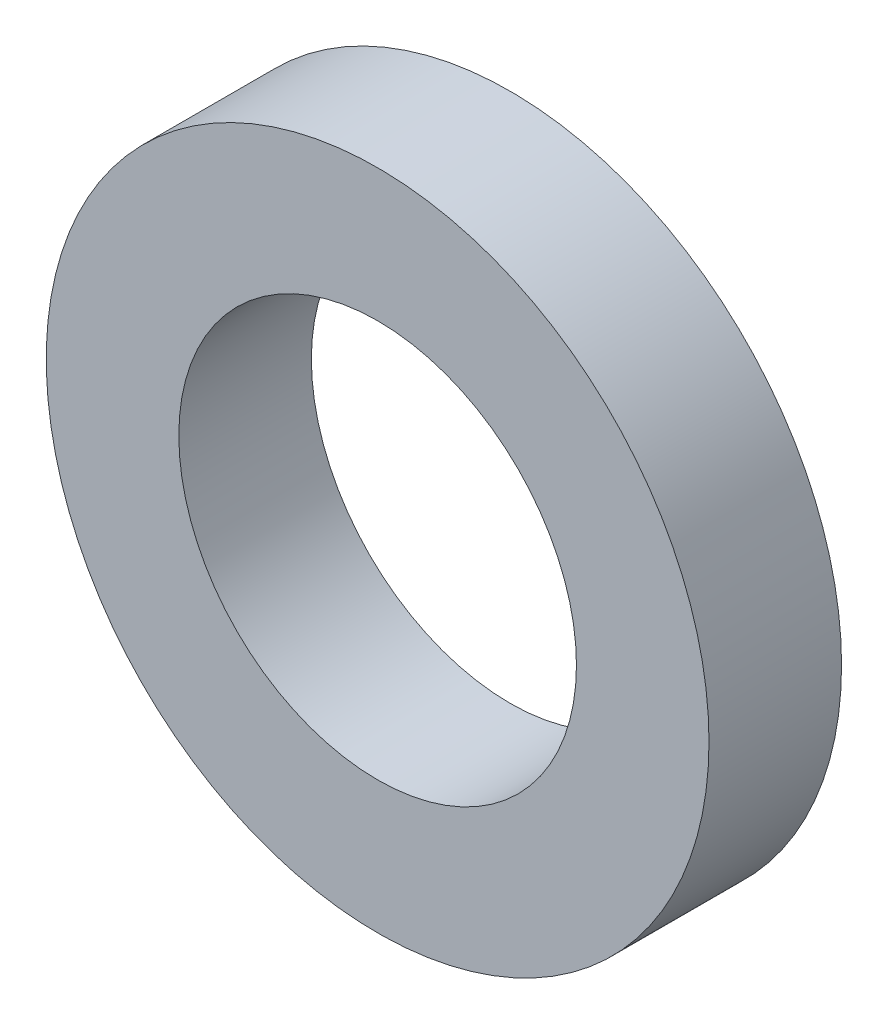
ISO-10303-21;
HEADER;
FILE_DESCRIPTION(('STEP AP214'),'2;1');
FILE_NAME('part.step','',(''),(''),'','','');
FILE_SCHEMA(('AUTOMOTIVE_DESIGN { 1 0 10303 214 1 1 1 1 }'));
ENDSEC;
DATA;
#1=APPLICATION_CONTEXT('core data for automotive mechanical design processes');
#2=APPLICATION_PROTOCOL_DEFINITION('international standard','automotive_design',2000,#1);
#3=PRODUCT_CONTEXT('',#1,'mechanical');
#4=PRODUCT('Part','Part','',(#3));
#5=PRODUCT_RELATED_PRODUCT_CATEGORY('part','',(#4));
#6=PRODUCT_DEFINITION_FORMATION('','',#4);
#7=PRODUCT_DEFINITION_CONTEXT('part definition',#1,'design');
#8=PRODUCT_DEFINITION('design','',#6,#7);
#9=PRODUCT_DEFINITION_SHAPE('','',#8);
#10=(LENGTH_UNIT() NAMED_UNIT(*) SI_UNIT(.MILLI.,.METRE.));
#11=(NAMED_UNIT(*) PLANE_ANGLE_UNIT() SI_UNIT($,.RADIAN.));
#12=(NAMED_UNIT(*) SI_UNIT($,.STERADIAN.) SOLID_ANGLE_UNIT());
#13=UNCERTAINTY_MEASURE_WITH_UNIT(LENGTH_MEASURE(1.E-05),#10,'distance_accuracy_value','');
#14=(GEOMETRIC_REPRESENTATION_CONTEXT(3) GLOBAL_UNCERTAINTY_ASSIGNED_CONTEXT((#13)) GLOBAL_UNIT_ASSIGNED_CONTEXT((#10,
#11,#12)) REPRESENTATION_CONTEXT('',''));
#15=CARTESIAN_POINT('',(0.,0.,0.));
#16=DIRECTION('',(0.,0.,1.));
#17=DIRECTION('',(1.,0.,0.));
#18=AXIS2_PLACEMENT_3D('',#15,#16,#17);
#19=CARTESIAN_POINT('',(0.,0.,10.));
#20=DIRECTION('',(0.,0.,1.));
#21=DIRECTION('',(1.,0.,0.));
#22=AXIS2_PLACEMENT_3D('',#19,#20,#21);
#23=PLANE('',#22);
#24=CARTESIAN_POINT('',(0.,0.,10.));
#25=DIRECTION('',(0.,0.,1.));
#26=DIRECTION('',(1.,0.,0.));
#27=AXIS2_PLACEMENT_3D('',#24,#25,#26);
#28=CIRCLE('',#27,25.);
#29=CARTESIAN_POINT('',(25.,0.,10.));
#30=VERTEX_POINT('',#29);
#31=EDGE_CURVE('E10',#30,#30,#28,.T.);
#32=ORIENTED_EDGE('',*,*,#31,.T.);
#33=EDGE_LOOP('',(#32));
#34=FACE_BOUND('',#33,.T.);
#35=CARTESIAN_POINT('',(0.,0.,10.));
#36=DIRECTION('',(0.,0.,1.));
#37=DIRECTION('',(1.,0.,0.));
#38=AXIS2_PLACEMENT_3D('',#35,#36,#37);
#39=CIRCLE('',#38,15.);
#40=CARTESIAN_POINT('',(15.,0.,10.));
#41=VERTEX_POINT('',#40);
#42=EDGE_CURVE('E40',#41,#41,#39,.T.);
#43=ORIENTED_EDGE('',*,*,#42,.F.);
#44=EDGE_LOOP('',(#43));
#45=FACE_BOUND('',#44,.T.);
#46=ADVANCED_FACE('F29',(#34,#45),#23,.T.);
#47=CARTESIAN_POINT('',(0.,0.,0.));
#48=DIRECTION('',(0.,0.,1.));
#49=DIRECTION('',(1.,0.,0.));
#50=AXIS2_PLACEMENT_3D('',#47,#48,#49);
#51=PLANE('',#50);
#52=CARTESIAN_POINT('',(0.,0.,0.));
#53=DIRECTION('',(0.,0.,1.));
#54=DIRECTION('',(1.,0.,0.));
#55=AXIS2_PLACEMENT_3D('',#52,#53,#54);
#56=CIRCLE('',#55,25.);
#57=CARTESIAN_POINT('',(25.,0.,0.));
#58=VERTEX_POINT('',#57);
#59=EDGE_CURVE('E33',#58,#58,#56,.T.);
#60=ORIENTED_EDGE('',*,*,#59,.F.);
#61=EDGE_LOOP('',(#60));
#62=FACE_BOUND('',#61,.T.);
#63=CARTESIAN_POINT('',(0.,0.,0.));
#64=DIRECTION('',(0.,0.,1.));
#65=DIRECTION('',(1.,0.,0.));
#66=AXIS2_PLACEMENT_3D('',#63,#64,#65);
#67=CIRCLE('',#66,15.);
#68=CARTESIAN_POINT('',(15.,0.,0.));
#69=VERTEX_POINT('',#68);
#70=EDGE_CURVE('E42',#69,#69,#67,.T.);
#71=ORIENTED_EDGE('',*,*,#70,.T.);
#72=EDGE_LOOP('',(#71));
#73=FACE_BOUND('',#72,.T.);
#74=ADVANCED_FACE('F52',(#62,#73),#51,.F.);
#75=CARTESIAN_POINT('',(0.,0.,10.));
#76=DIRECTION('',(0.,0.,-1.));
#77=DIRECTION('',(-1.,0.,0.));
#78=AXIS2_PLACEMENT_3D('',#75,#76,#77);
#79=CYLINDRICAL_SURFACE('',#78,25.);
#80=ORIENTED_EDGE('',*,*,#31,.F.);
#81=EDGE_LOOP('',(#80));
#82=FACE_BOUND('',#81,.T.);
#83=ORIENTED_EDGE('',*,*,#59,.T.);
#84=EDGE_LOOP('',(#83));
#85=FACE_BOUND('',#84,.T.);
#86=ADVANCED_FACE('F31',(#82,#85),#79,.T.);
#87=CARTESIAN_POINT('',(0.,0.,10.));
#88=DIRECTION('',(0.,0.,-1.));
#89=DIRECTION('',(-1.,0.,0.));
#90=AXIS2_PLACEMENT_3D('',#87,#88,#89);
#91=CYLINDRICAL_SURFACE('',#90,15.);
#92=ORIENTED_EDGE('',*,*,#42,.T.);
#93=EDGE_LOOP('',(#92));
#94=FACE_BOUND('',#93,.T.);
#95=ORIENTED_EDGE('',*,*,#70,.F.);
#96=EDGE_LOOP('',(#95));
#97=FACE_BOUND('',#96,.T.);
#98=ADVANCED_FACE('F48',(#94,#97),#91,.F.);
#99=CLOSED_SHELL('',(#46,#74,#86,#98));
#100=MANIFOLD_SOLID_BREP('B2',#99);
#101=ADVANCED_BREP_SHAPE_REPRESENTATION('',(#18,#100),#14);
#102=SHAPE_DEFINITION_REPRESENTATION(#9,#101);
ENDSEC;
END-ISO-10303-21;
